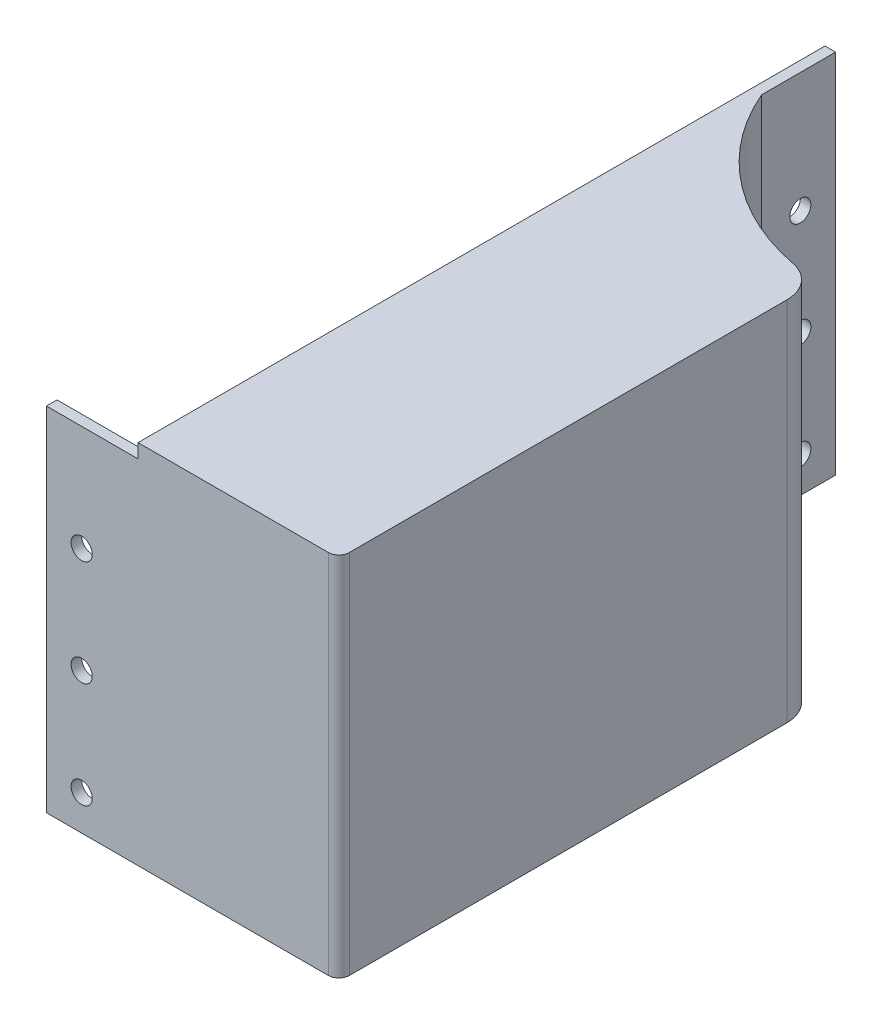
ISO-10303-21;
HEADER;
FILE_DESCRIPTION(('STEP AP214'),'2;1');
FILE_NAME('part.step','',(''),(''),'','','');
FILE_SCHEMA(('AUTOMOTIVE_DESIGN { 1 0 10303 214 1 1 1 1 }'));
ENDSEC;
DATA;
#1=APPLICATION_CONTEXT('core data for automotive mechanical design processes');
#2=APPLICATION_PROTOCOL_DEFINITION('international standard','automotive_design',2000,#1);
#3=PRODUCT_CONTEXT('',#1,'mechanical');
#4=PRODUCT('Part','Part','',(#3));
#5=PRODUCT_RELATED_PRODUCT_CATEGORY('part','',(#4));
#6=PRODUCT_DEFINITION_FORMATION('','',#4);
#7=PRODUCT_DEFINITION_CONTEXT('part definition',#1,'design');
#8=PRODUCT_DEFINITION('design','',#6,#7);
#9=PRODUCT_DEFINITION_SHAPE('','',#8);
#10=(LENGTH_UNIT() NAMED_UNIT(*) SI_UNIT(.MILLI.,.METRE.));
#11=(NAMED_UNIT(*) PLANE_ANGLE_UNIT() SI_UNIT($,.RADIAN.));
#12=(NAMED_UNIT(*) SI_UNIT($,.STERADIAN.) SOLID_ANGLE_UNIT());
#13=UNCERTAINTY_MEASURE_WITH_UNIT(LENGTH_MEASURE(1.E-05),#10,'distance_accuracy_value','');
#14=(GEOMETRIC_REPRESENTATION_CONTEXT(3) GLOBAL_UNCERTAINTY_ASSIGNED_CONTEXT((#13)) GLOBAL_UNIT_ASSIGNED_CONTEXT((#10,
#11,#12)) REPRESENTATION_CONTEXT('',''));
#15=CARTESIAN_POINT('',(0.,0.,0.));
#16=DIRECTION('',(0.,0.,1.));
#17=DIRECTION('',(1.,0.,0.));
#18=AXIS2_PLACEMENT_3D('',#15,#16,#17);
#19=CARTESIAN_POINT('',(58.5616033549649,100.,-174.880780034734));
#20=DIRECTION('',(0.,-1.,0.));
#21=DIRECTION('',(0.,0.,-1.));
#22=AXIS2_PLACEMENT_3D('',#19,#20,#21);
#23=PLANE('',#22);
#24=DIRECTION('',(0.,0.,1.));
#25=VECTOR('',#24,1.);
#26=CARTESIAN_POINT('',(0.,100.,-176.272615505532));
#27=LINE('',#26,#25);
#28=CARTESIAN_POINT('',(0.,100.,15.7273844944684));
#29=VERTEX_POINT('',#28);
#30=CARTESIAN_POINT('',(0.,100.,18.7273844944685));
#31=VERTEX_POINT('',#30);
#32=EDGE_CURVE('E11',#29,#31,#27,.T.);
#33=ORIENTED_EDGE('',*,*,#32,.F.);
#34=DIRECTION('',(-1.,0.,0.));
#35=VECTOR('',#34,1.);
#36=CARTESIAN_POINT('',(-26.,100.,15.7273844944684));
#37=LINE('',#36,#35);
#38=CARTESIAN_POINT('',(-26.,100.,15.7273844944684));
#39=VERTEX_POINT('',#38);
#40=EDGE_CURVE('E250',#29,#39,#37,.T.);
#41=ORIENTED_EDGE('',*,*,#40,.T.);
#42=DIRECTION('',(0.,0.,1.));
#43=VECTOR('',#42,1.);
#44=CARTESIAN_POINT('',(-26.,100.,18.7273844944685));
#45=LINE('',#44,#43);
#46=CARTESIAN_POINT('',(-26.,100.,18.7273844944685));
#47=VERTEX_POINT('',#46);
#48=EDGE_CURVE('E255',#39,#47,#45,.T.);
#49=ORIENTED_EDGE('',*,*,#48,.T.);
#50=DIRECTION('',(1.,0.,0.));
#51=VECTOR('',#50,1.);
#52=CARTESIAN_POINT('',(57.,100.,18.7273844944684));
#53=LINE('',#52,#51);
#54=EDGE_CURVE('E258',#47,#31,#53,.T.);
#55=ORIENTED_EDGE('',*,*,#54,.T.);
#56=EDGE_LOOP('',(#33,#41,#49,#55));
#57=FACE_BOUND('',#56,.T.);
#58=ADVANCED_FACE('F39',(#57),#23,.F.);
#59=CARTESIAN_POINT('',(58.5616033549649,100.,-174.880780034734));
#60=DIRECTION('',(0.,-1.,0.));
#61=DIRECTION('',(0.,0.,-1.));
#62=AXIS2_PLACEMENT_3D('',#59,#60,#61);
#63=CYLINDRICAL_SURFACE('',#62,62.7741227806787);
#64=CARTESIAN_POINT('',(58.5616033549649,0.,-174.880780034734));
#65=DIRECTION('',(0.,1.,0.));
#66=DIRECTION('',(0.,0.,-1.));
#67=AXIS2_PLACEMENT_3D('',#64,#65,#66);
#68=CIRCLE('',#67,62.7741227806787);
#69=CARTESIAN_POINT('',(0.,0.,-152.272615505532));
#70=VERTEX_POINT('',#69);
#71=CARTESIAN_POINT('',(49.7054022215755,0.,-112.734515526168));
#72=VERTEX_POINT('',#71);
#73=EDGE_CURVE('E240',#70,#72,#68,.T.);
#74=ORIENTED_EDGE('',*,*,#73,.T.);
#75=DIRECTION('',(0.,-1.,0.));
#76=VECTOR('',#75,1.);
#77=CARTESIAN_POINT('',(49.7054022215755,100.,-112.734515526168));
#78=LINE('',#77,#76);
#79=CARTESIAN_POINT('',(49.7054022215755,100.,-112.734515526168));
#80=VERTEX_POINT('',#79);
#81=EDGE_CURVE('E63',#72,#80,#78,.F.);
#82=ORIENTED_EDGE('',*,*,#81,.T.);
#83=CARTESIAN_POINT('',(58.5616033549649,100.,-174.880780034734));
#84=DIRECTION('',(0.,1.,0.));
#85=DIRECTION('',(0.,0.,-1.));
#86=AXIS2_PLACEMENT_3D('',#83,#84,#85);
#87=CIRCLE('',#86,62.7741227806787);
#88=CARTESIAN_POINT('',(0.,100.,-152.272615505532));
#89=VERTEX_POINT('',#88);
#90=EDGE_CURVE('E241',#89,#80,#87,.T.);
#91=ORIENTED_EDGE('',*,*,#90,.F.);
#92=DIRECTION('',(0.,-1.,0.));
#93=VECTOR('',#92,1.);
#94=CARTESIAN_POINT('',(0.,100.,-152.272615505532));
#95=LINE('',#94,#93);
#96=EDGE_CURVE('E261',#89,#70,#95,.T.);
#97=ORIENTED_EDGE('',*,*,#96,.T.);
#98=EDGE_LOOP('',(#74,#82,#91,#97));
#99=FACE_BOUND('',#98,.T.);
#100=ADVANCED_FACE('F378',(#99),#63,.T.);
#101=CARTESIAN_POINT('',(54.,100.,15.7273844944684));
#102=DIRECTION('',(1.,0.,0.));
#103=DIRECTION('',(0.,0.,-1.));
#104=AXIS2_PLACEMENT_3D('',#101,#102,#103);
#105=PLANE('',#104);
#106=DIRECTION('',(0.,0.,1.));
#107=VECTOR('',#106,1.);
#108=CARTESIAN_POINT('',(54.,100.,15.7273844944684));
#109=LINE('',#108,#107);
#110=CARTESIAN_POINT('',(54.,100.,-107.784524848824));
#111=VERTEX_POINT('',#110);
#112=CARTESIAN_POINT('',(54.,100.,15.7273844944684));
#113=VERTEX_POINT('',#112);
#114=EDGE_CURVE('E245',#111,#113,#109,.T.);
#115=ORIENTED_EDGE('',*,*,#114,.F.);
#116=DIRECTION('',(0.,1.,0.));
#117=VECTOR('',#116,1.);
#118=CARTESIAN_POINT('',(54.,0.,-107.784524848824));
#119=LINE('',#118,#117);
#120=CARTESIAN_POINT('',(54.,0.,-107.784524848824));
#121=VERTEX_POINT('',#120);
#122=EDGE_CURVE('E330',#111,#121,#119,.F.);
#123=ORIENTED_EDGE('',*,*,#122,.T.);
#124=DIRECTION('',(0.,0.,1.));
#125=VECTOR('',#124,1.);
#126=CARTESIAN_POINT('',(54.,0.,15.7273844944684));
#127=LINE('',#126,#125);
#128=CARTESIAN_POINT('',(54.,0.,15.7273844944684));
#129=VERTEX_POINT('',#128);
#130=EDGE_CURVE('E264',#121,#129,#127,.T.);
#131=ORIENTED_EDGE('',*,*,#130,.T.);
#132=DIRECTION('',(0.,-1.,0.));
#133=VECTOR('',#132,1.);
#134=CARTESIAN_POINT('',(54.,100.,15.7273844944684));
#135=LINE('',#134,#133);
#136=EDGE_CURVE('E305',#113,#129,#135,.T.);
#137=ORIENTED_EDGE('',*,*,#136,.F.);
#138=EDGE_LOOP('',(#115,#123,#131,#137));
#139=FACE_BOUND('',#138,.T.);
#140=ADVANCED_FACE('F358',(#139),#105,.F.);
#141=CARTESIAN_POINT('',(-26.,100.,15.7273844944684));
#142=DIRECTION('',(0.,0.,1.));
#143=DIRECTION('',(1.,0.,0.));
#144=AXIS2_PLACEMENT_3D('',#141,#142,#143);
#145=PLANE('',#144);
#146=CARTESIAN_POINT('',(-16.0000000000006,70.,15.7273844944684));
#147=DIRECTION('',(0.,0.,1.));
#148=DIRECTION('',(1.,0.,0.));
#149=AXIS2_PLACEMENT_3D('',#146,#147,#148);
#150=CIRCLE('',#149,3.);
#151=CARTESIAN_POINT('',(-13.0000000000006,70.,15.7273844944684));
#152=VERTEX_POINT('',#151);
#153=EDGE_CURVE('E236',#152,#152,#150,.T.);
#154=ORIENTED_EDGE('',*,*,#153,.T.);
#155=EDGE_LOOP('',(#154));
#156=FACE_BOUND('',#155,.T.);
#157=CARTESIAN_POINT('',(-16.0000000000003,40.,15.7273844944684));
#158=DIRECTION('',(0.,0.,1.));
#159=DIRECTION('',(1.,0.,0.));
#160=AXIS2_PLACEMENT_3D('',#157,#158,#159);
#161=CIRCLE('',#160,3.);
#162=CARTESIAN_POINT('',(-13.0000000000003,40.,15.7273844944684));
#163=VERTEX_POINT('',#162);
#164=EDGE_CURVE('E232',#163,#163,#161,.T.);
#165=ORIENTED_EDGE('',*,*,#164,.T.);
#166=EDGE_LOOP('',(#165));
#167=FACE_BOUND('',#166,.T.);
#168=CARTESIAN_POINT('',(-16.,10.,15.7273844944684));
#169=DIRECTION('',(0.,0.,1.));
#170=DIRECTION('',(1.,0.,0.));
#171=AXIS2_PLACEMENT_3D('',#168,#169,#170);
#172=CIRCLE('',#171,3.);
#173=CARTESIAN_POINT('',(-13.,10.,15.7273844944684));
#174=VERTEX_POINT('',#173);
#175=EDGE_CURVE('E219',#174,#174,#172,.T.);
#176=ORIENTED_EDGE('',*,*,#175,.T.);
#177=EDGE_LOOP('',(#176));
#178=FACE_BOUND('',#177,.T.);
#179=DIRECTION('',(-1.,0.,0.));
#180=VECTOR('',#179,1.);
#181=CARTESIAN_POINT('',(-26.,0.,15.7273844944684));
#182=LINE('',#181,#180);
#183=CARTESIAN_POINT('',(-26.,0.,15.7273844944684));
#184=VERTEX_POINT('',#183);
#185=EDGE_CURVE('E267',#129,#184,#182,.T.);
#186=ORIENTED_EDGE('',*,*,#185,.T.);
#187=DIRECTION('',(0.,-1.,0.));
#188=VECTOR('',#187,1.);
#189=CARTESIAN_POINT('',(-26.,100.,15.7273844944684));
#190=LINE('',#189,#188);
#191=EDGE_CURVE('E301',#39,#184,#190,.T.);
#192=ORIENTED_EDGE('',*,*,#191,.F.);
#193=ORIENTED_EDGE('',*,*,#40,.F.);
#194=EDGE_CURVE('E251',#113,#29,#37,.T.);
#195=ORIENTED_EDGE('',*,*,#194,.F.);
#196=ORIENTED_EDGE('',*,*,#136,.T.);
#197=EDGE_LOOP('',(#186,#192,#193,#195,#196));
#198=FACE_BOUND('',#197,.T.);
#199=ADVANCED_FACE('F366',(#156,#167,#178,#198),#145,.F.);
#200=CARTESIAN_POINT('',(-26.,100.,18.7273844944685));
#201=DIRECTION('',(1.,0.,0.));
#202=DIRECTION('',(0.,0.,-1.));
#203=AXIS2_PLACEMENT_3D('',#200,#201,#202);
#204=PLANE('',#203);
#205=DIRECTION('',(0.,0.,1.));
#206=VECTOR('',#205,1.);
#207=CARTESIAN_POINT('',(-26.,0.,18.7273844944685));
#208=LINE('',#207,#206);
#209=CARTESIAN_POINT('',(-26.,0.,18.7273844944685));
#210=VERTEX_POINT('',#209);
#211=EDGE_CURVE('E270',#184,#210,#208,.T.);
#212=ORIENTED_EDGE('',*,*,#211,.T.);
#213=DIRECTION('',(0.,-1.,0.));
#214=VECTOR('',#213,1.);
#215=CARTESIAN_POINT('',(-26.,100.,18.7273844944685));
#216=LINE('',#215,#214);
#217=EDGE_CURVE('E297',#47,#210,#216,.T.);
#218=ORIENTED_EDGE('',*,*,#217,.F.);
#219=ORIENTED_EDGE('',*,*,#48,.F.);
#220=ORIENTED_EDGE('',*,*,#191,.T.);
#221=EDGE_LOOP('',(#212,#218,#219,#220));
#222=FACE_BOUND('',#221,.T.);
#223=ADVANCED_FACE('F370',(#222),#204,.F.);
#224=CARTESIAN_POINT('',(57.,100.,18.7273844944684));
#225=DIRECTION('',(0.,0.,-1.));
#226=DIRECTION('',(-1.,0.,0.));
#227=AXIS2_PLACEMENT_3D('',#224,#225,#226);
#228=PLANE('',#227);
#229=CARTESIAN_POINT('',(-16.0000000000006,70.,18.7273844944685));
#230=DIRECTION('',(0.,0.,1.));
#231=DIRECTION('',(1.,0.,0.));
#232=AXIS2_PLACEMENT_3D('',#229,#230,#231);
#233=CIRCLE('',#232,3.);
#234=CARTESIAN_POINT('',(-13.0000000000006,70.,18.7273844944685));
#235=VERTEX_POINT('',#234);
#236=EDGE_CURVE('E215',#235,#235,#233,.T.);
#237=ORIENTED_EDGE('',*,*,#236,.F.);
#238=EDGE_LOOP('',(#237));
#239=FACE_BOUND('',#238,.T.);
#240=CARTESIAN_POINT('',(-16.0000000000003,40.,18.7273844944685));
#241=DIRECTION('',(0.,0.,1.));
#242=DIRECTION('',(1.,0.,0.));
#243=AXIS2_PLACEMENT_3D('',#240,#241,#242);
#244=CIRCLE('',#243,3.);
#245=CARTESIAN_POINT('',(-13.0000000000003,40.,18.7273844944685));
#246=VERTEX_POINT('',#245);
#247=EDGE_CURVE('E220',#246,#246,#244,.T.);
#248=ORIENTED_EDGE('',*,*,#247,.F.);
#249=EDGE_LOOP('',(#248));
#250=FACE_BOUND('',#249,.T.);
#251=CARTESIAN_POINT('',(-16.,10.,18.7273844944685));
#252=DIRECTION('',(0.,0.,1.));
#253=DIRECTION('',(1.,0.,0.));
#254=AXIS2_PLACEMENT_3D('',#251,#252,#253);
#255=CIRCLE('',#254,3.);
#256=CARTESIAN_POINT('',(-13.,10.,18.7273844944685));
#257=VERTEX_POINT('',#256);
#258=EDGE_CURVE('E224',#257,#257,#255,.T.);
#259=ORIENTED_EDGE('',*,*,#258,.F.);
#260=EDGE_LOOP('',(#259));
#261=FACE_BOUND('',#260,.T.);
#262=DIRECTION('',(1.,0.,0.));
#263=VECTOR('',#262,1.);
#264=CARTESIAN_POINT('',(57.,0.,18.7273844944684));
#265=LINE('',#264,#263);
#266=CARTESIAN_POINT('',(54.,0.,18.7273844944684));
#267=VERTEX_POINT('',#266);
#268=EDGE_CURVE('E273',#210,#267,#265,.T.);
#269=ORIENTED_EDGE('',*,*,#268,.T.);
#270=DIRECTION('',(0.,-1.,0.));
#271=VECTOR('',#270,1.);
#272=CARTESIAN_POINT('',(54.,100.,18.7273844944684));
#273=LINE('',#272,#271);
#274=CARTESIAN_POINT('',(54.,104.,18.7273844944684));
#275=VERTEX_POINT('',#274);
#276=EDGE_CURVE('E327',#267,#275,#273,.F.);
#277=ORIENTED_EDGE('',*,*,#276,.T.);
#278=DIRECTION('',(1.,0.,0.));
#279=VECTOR('',#278,1.);
#280=CARTESIAN_POINT('',(0.,104.,18.7273844944685));
#281=LINE('',#280,#279);
#282=CARTESIAN_POINT('',(0.,104.,18.7273844944685));
#283=VERTEX_POINT('',#282);
#284=EDGE_CURVE('E181',#283,#275,#281,.T.);
#285=ORIENTED_EDGE('',*,*,#284,.F.);
#286=DIRECTION('',(0.,-1.,0.));
#287=VECTOR('',#286,1.);
#288=CARTESIAN_POINT('',(0.,104.,18.7273844944685));
#289=LINE('',#288,#287);
#290=EDGE_CURVE('E197',#283,#31,#289,.T.);
#291=ORIENTED_EDGE('',*,*,#290,.T.);
#292=ORIENTED_EDGE('',*,*,#54,.F.);
#293=ORIENTED_EDGE('',*,*,#217,.T.);
#294=EDGE_LOOP('',(#269,#277,#285,#291,#292,#293));
#295=FACE_BOUND('',#294,.T.);
#296=ADVANCED_FACE('F414',(#239,#250,#261,#295),#228,.F.);
#297=CARTESIAN_POINT('',(57.,100.,-117.272615505532));
#298=DIRECTION('',(-1.,0.,0.));
#299=DIRECTION('',(0.,0.,1.));
#300=AXIS2_PLACEMENT_3D('',#297,#298,#299);
#301=PLANE('',#300);
#302=DIRECTION('',(0.,-1.,0.));
#303=VECTOR('',#302,1.);
#304=CARTESIAN_POINT('',(57.,100.,-108.468113503645));
#305=LINE('',#304,#303);
#306=CARTESIAN_POINT('',(57.,0.,-108.468113503645));
#307=VERTEX_POINT('',#306);
#308=CARTESIAN_POINT('',(57.,104.,-108.468113503645));
#309=VERTEX_POINT('',#308);
#310=EDGE_CURVE('E317',#307,#309,#305,.F.);
#311=ORIENTED_EDGE('',*,*,#310,.T.);
#312=DIRECTION('',(0.,0.,-1.));
#313=VECTOR('',#312,1.);
#314=CARTESIAN_POINT('',(57.,104.,15.7273844944684));
#315=LINE('',#314,#313);
#316=CARTESIAN_POINT('',(57.,104.,15.7273844944684));
#317=VERTEX_POINT('',#316);
#318=EDGE_CURVE('E189',#317,#309,#315,.T.);
#319=ORIENTED_EDGE('',*,*,#318,.F.);
#320=DIRECTION('',(0.,-1.,0.));
#321=VECTOR('',#320,1.);
#322=CARTESIAN_POINT('',(57.,100.,15.7273844944684));
#323=LINE('',#322,#321);
#324=CARTESIAN_POINT('',(57.,0.,15.7273844944684));
#325=VERTEX_POINT('',#324);
#326=EDGE_CURVE('E320',#317,#325,#323,.T.);
#327=ORIENTED_EDGE('',*,*,#326,.T.);
#328=DIRECTION('',(0.,0.,-1.));
#329=VECTOR('',#328,1.);
#330=CARTESIAN_POINT('',(57.,0.,-117.272615505532));
#331=LINE('',#330,#329);
#332=EDGE_CURVE('E277',#325,#307,#331,.T.);
#333=ORIENTED_EDGE('',*,*,#332,.T.);
#334=EDGE_LOOP('',(#311,#319,#327,#333));
#335=FACE_BOUND('',#334,.T.);
#336=ADVANCED_FACE('F408',(#335),#301,.F.);
#337=CARTESIAN_POINT('',(60.7261232311468,100.,-179.936053781372));
#338=DIRECTION('',(0.,-1.,0.));
#339=DIRECTION('',(0.,0.,-1.));
#340=AXIS2_PLACEMENT_3D('',#337,#338,#339);
#341=CYLINDRICAL_SURFACE('',#340,62.7741227806788);
#342=DIRECTION('',(0.,-1.,0.));
#343=VECTOR('',#342,1.);
#344=CARTESIAN_POINT('',(3.,100.,-155.272615505532));
#345=LINE('',#344,#343);
#346=CARTESIAN_POINT('',(2.99999999999998,104.,-155.272615505532));
#347=VERTEX_POINT('',#346);
#348=CARTESIAN_POINT('',(3.,0.,-155.272615505532));
#349=VERTEX_POINT('',#348);
#350=EDGE_CURVE('E157',#347,#349,#345,.T.);
#351=ORIENTED_EDGE('',*,*,#350,.F.);
#352=CARTESIAN_POINT('',(60.7261232311468,104.,-179.936053781372));
#353=DIRECTION('',(0.,-1.,0.));
#354=DIRECTION('',(0.,0.,1.));
#355=AXIS2_PLACEMENT_3D('',#352,#353,#354);
#356=CIRCLE('',#355,62.7741227806788);
#357=CARTESIAN_POINT('',(48.8861269235101,104.,-118.288629031275));
#358=VERTEX_POINT('',#357);
#359=EDGE_CURVE('E173',#358,#347,#356,.T.);
#360=ORIENTED_EDGE('',*,*,#359,.F.);
#361=DIRECTION('',(0.,-1.,0.));
#362=VECTOR('',#361,1.);
#363=CARTESIAN_POINT('',(48.8861269235101,100.,-118.288629031275));
#364=LINE('',#363,#362);
#365=CARTESIAN_POINT('',(48.8861269235101,0.,-118.288629031275));
#366=VERTEX_POINT('',#365);
#367=EDGE_CURVE('E309',#358,#366,#364,.T.);
#368=ORIENTED_EDGE('',*,*,#367,.T.);
#369=CARTESIAN_POINT('',(60.7261232311468,0.,-179.936053781372));
#370=DIRECTION('',(0.,-1.,0.));
#371=DIRECTION('',(0.,0.,-1.));
#372=AXIS2_PLACEMENT_3D('',#369,#370,#371);
#373=CIRCLE('',#372,62.7741227806788);
#374=EDGE_CURVE('E280',#366,#349,#373,.T.);
#375=ORIENTED_EDGE('',*,*,#374,.T.);
#376=EDGE_LOOP('',(#351,#360,#368,#375));
#377=FACE_BOUND('',#376,.T.);
#378=ADVANCED_FACE('F411',(#377),#341,.F.);
#379=CARTESIAN_POINT('',(3.,100.,-176.272615505532));
#380=DIRECTION('',(-1.,0.,0.));
#381=DIRECTION('',(0.,0.,1.));
#382=AXIS2_PLACEMENT_3D('',#379,#380,#381);
#383=PLANE('',#382);
#384=CARTESIAN_POINT('',(3.,10.,-166.272615505532));
#385=DIRECTION('',(1.,0.,0.));
#386=DIRECTION('',(0.,0.,-1.));
#387=AXIS2_PLACEMENT_3D('',#384,#385,#386);
#388=CIRCLE('',#387,2.99999999999999);
#389=CARTESIAN_POINT('',(3.,10.,-169.272615505532));
#390=VERTEX_POINT('',#389);
#391=EDGE_CURVE('E203',#390,#390,#388,.T.);
#392=ORIENTED_EDGE('',*,*,#391,.F.);
#393=EDGE_LOOP('',(#392));
#394=FACE_BOUND('',#393,.T.);
#395=CARTESIAN_POINT('',(3.,40.,-166.272615505531));
#396=DIRECTION('',(1.,0.,0.));
#397=DIRECTION('',(0.,0.,-1.));
#398=AXIS2_PLACEMENT_3D('',#395,#396,#397);
#399=CIRCLE('',#398,2.99999999999999);
#400=CARTESIAN_POINT('',(3.,40.,-169.272615505531));
#401=VERTEX_POINT('',#400);
#402=EDGE_CURVE('E208',#401,#401,#399,.T.);
#403=ORIENTED_EDGE('',*,*,#402,.F.);
#404=EDGE_LOOP('',(#403));
#405=FACE_BOUND('',#404,.T.);
#406=CARTESIAN_POINT('',(3.,70.,-166.272615505531));
#407=DIRECTION('',(1.,0.,0.));
#408=DIRECTION('',(0.,0.,-1.));
#409=AXIS2_PLACEMENT_3D('',#406,#407,#408);
#410=CIRCLE('',#409,2.99999999999999);
#411=CARTESIAN_POINT('',(3.,70.,-169.272615505531));
#412=VERTEX_POINT('',#411);
#413=EDGE_CURVE('E202',#412,#412,#410,.T.);
#414=ORIENTED_EDGE('',*,*,#413,.F.);
#415=EDGE_LOOP('',(#414));
#416=FACE_BOUND('',#415,.T.);
#417=DIRECTION('',(0.,0.,-1.));
#418=VECTOR('',#417,1.);
#419=CARTESIAN_POINT('',(3.,0.,-176.272615505532));
#420=LINE('',#419,#418);
#421=CARTESIAN_POINT('',(3.,0.,-176.272615505532));
#422=VERTEX_POINT('',#421);
#423=EDGE_CURVE('E153',#349,#422,#420,.T.);
#424=ORIENTED_EDGE('',*,*,#423,.T.);
#425=DIRECTION('',(0.,-1.,0.));
#426=VECTOR('',#425,1.);
#427=CARTESIAN_POINT('',(3.,100.,-176.272615505532));
#428=LINE('',#427,#426);
#429=CARTESIAN_POINT('',(3.,104.,-176.272615505532));
#430=VERTEX_POINT('',#429);
#431=EDGE_CURVE('E146',#430,#422,#428,.T.);
#432=ORIENTED_EDGE('',*,*,#431,.F.);
#433=DIRECTION('',(0.,0.,-1.));
#434=VECTOR('',#433,1.);
#435=CARTESIAN_POINT('',(3.,104.,-155.272615505532));
#436=LINE('',#435,#434);
#437=EDGE_CURVE('E151',#347,#430,#436,.T.);
#438=ORIENTED_EDGE('',*,*,#437,.F.);
#439=ORIENTED_EDGE('',*,*,#350,.T.);
#440=EDGE_LOOP('',(#424,#432,#438,#439));
#441=FACE_BOUND('',#440,.T.);
#442=ADVANCED_FACE('F148',(#394,#405,#416,#441),#383,.F.);
#443=CARTESIAN_POINT('',(0.,100.,-176.272615505532));
#444=DIRECTION('',(0.,0.,1.));
#445=DIRECTION('',(1.,0.,0.));
#446=AXIS2_PLACEMENT_3D('',#443,#444,#445);
#447=PLANE('',#446);
#448=DIRECTION('',(-1.,0.,0.));
#449=VECTOR('',#448,1.);
#450=CARTESIAN_POINT('',(0.,0.,-176.272615505532));
#451=LINE('',#450,#449);
#452=CARTESIAN_POINT('',(0.,0.,-176.272615505532));
#453=VERTEX_POINT('',#452);
#454=EDGE_CURVE('E285',#422,#453,#451,.T.);
#455=ORIENTED_EDGE('',*,*,#454,.T.);
#456=DIRECTION('',(0.,-1.,0.));
#457=VECTOR('',#456,1.);
#458=CARTESIAN_POINT('',(0.,100.,-176.272615505532));
#459=LINE('',#458,#457);
#460=CARTESIAN_POINT('',(0.,104.,-176.272615505532));
#461=VERTEX_POINT('',#460);
#462=EDGE_CURVE('E158',#461,#453,#459,.T.);
#463=ORIENTED_EDGE('',*,*,#462,.F.);
#464=DIRECTION('',(-1.,0.,0.));
#465=VECTOR('',#464,1.);
#466=CARTESIAN_POINT('',(3.,104.,-176.272615505532));
#467=LINE('',#466,#465);
#468=EDGE_CURVE('E161',#430,#461,#467,.T.);
#469=ORIENTED_EDGE('',*,*,#468,.F.);
#470=ORIENTED_EDGE('',*,*,#431,.T.);
#471=EDGE_LOOP('',(#455,#463,#469,#470));
#472=FACE_BOUND('',#471,.T.);
#473=ADVANCED_FACE('F162',(#472),#447,.F.);
#474=CARTESIAN_POINT('',(0.,100.,-152.272615505532));
#475=DIRECTION('',(1.,0.,0.));
#476=DIRECTION('',(0.,0.,-1.));
#477=AXIS2_PLACEMENT_3D('',#474,#475,#476);
#478=PLANE('',#477);
#479=CARTESIAN_POINT('',(0.,10.,-166.272615505532));
#480=DIRECTION('',(1.,0.,0.));
#481=DIRECTION('',(0.,0.,-1.));
#482=AXIS2_PLACEMENT_3D('',#479,#480,#481);
#483=CIRCLE('',#482,2.99999999999999);
#484=CARTESIAN_POINT('',(0.,10.,-169.272615505532));
#485=VERTEX_POINT('',#484);
#486=EDGE_CURVE('E228',#485,#485,#483,.T.);
#487=ORIENTED_EDGE('',*,*,#486,.T.);
#488=EDGE_LOOP('',(#487));
#489=FACE_BOUND('',#488,.T.);
#490=CARTESIAN_POINT('',(0.,40.,-166.272615505531));
#491=DIRECTION('',(1.,0.,0.));
#492=DIRECTION('',(0.,0.,-1.));
#493=AXIS2_PLACEMENT_3D('',#490,#491,#492);
#494=CIRCLE('',#493,2.99999999999999);
#495=CARTESIAN_POINT('',(0.,40.,-169.272615505531));
#496=VERTEX_POINT('',#495);
#497=EDGE_CURVE('E334',#496,#496,#494,.T.);
#498=ORIENTED_EDGE('',*,*,#497,.T.);
#499=EDGE_LOOP('',(#498));
#500=FACE_BOUND('',#499,.T.);
#501=CARTESIAN_POINT('',(0.,70.,-166.272615505531));
#502=DIRECTION('',(1.,0.,0.));
#503=DIRECTION('',(0.,0.,-1.));
#504=AXIS2_PLACEMENT_3D('',#501,#502,#503);
#505=CIRCLE('',#504,2.99999999999999);
#506=CARTESIAN_POINT('',(0.,70.,-169.272615505531));
#507=VERTEX_POINT('',#506);
#508=EDGE_CURVE('E207',#507,#507,#505,.T.);
#509=ORIENTED_EDGE('',*,*,#508,.T.);
#510=EDGE_LOOP('',(#509));
#511=FACE_BOUND('',#510,.T.);
#512=DIRECTION('',(0.,0.,1.));
#513=VECTOR('',#512,1.);
#514=CARTESIAN_POINT('',(0.,0.,-152.272615505532));
#515=LINE('',#514,#513);
#516=EDGE_CURVE('E246',#453,#70,#515,.T.);
#517=ORIENTED_EDGE('',*,*,#516,.T.);
#518=ORIENTED_EDGE('',*,*,#96,.F.);
#519=EDGE_CURVE('E50',#89,#29,#27,.T.);
#520=ORIENTED_EDGE('',*,*,#519,.T.);
#521=ORIENTED_EDGE('',*,*,#32,.T.);
#522=ORIENTED_EDGE('',*,*,#290,.F.);
#523=DIRECTION('',(0.,0.,1.));
#524=VECTOR('',#523,1.);
#525=CARTESIAN_POINT('',(0.,104.,-176.272615505532));
#526=LINE('',#525,#524);
#527=EDGE_CURVE('E167',#461,#283,#526,.T.);
#528=ORIENTED_EDGE('',*,*,#527,.F.);
#529=ORIENTED_EDGE('',*,*,#462,.T.);
#530=EDGE_LOOP('',(#517,#518,#520,#521,#522,#528,#529));
#531=FACE_BOUND('',#530,.T.);
#532=ADVANCED_FACE('F375',(#489,#500,#511,#531),#478,.F.);
#533=CARTESIAN_POINT('',(58.5616033549649,0.,-174.880780034734));
#534=DIRECTION('',(0.,-1.,0.));
#535=DIRECTION('',(0.,0.,-1.));
#536=AXIS2_PLACEMENT_3D('',#533,#534,#535);
#537=PLANE('',#536);
#538=ORIENTED_EDGE('',*,*,#332,.F.);
#539=CARTESIAN_POINT('',(54.,0.,15.7273844944684));
#540=DIRECTION('',(0.,-1.,0.));
#541=DIRECTION('',(0.,0.,-1.));
#542=AXIS2_PLACEMENT_3D('',#539,#540,#541);
#543=CIRCLE('',#542,3.);
#544=EDGE_CURVE('E324',#325,#267,#543,.T.);
#545=ORIENTED_EDGE('',*,*,#544,.T.);
#546=ORIENTED_EDGE('',*,*,#268,.F.);
#547=ORIENTED_EDGE('',*,*,#211,.F.);
#548=ORIENTED_EDGE('',*,*,#185,.F.);
#549=ORIENTED_EDGE('',*,*,#130,.F.);
#550=CARTESIAN_POINT('',(49.,0.,-107.784524848824));
#551=DIRECTION('',(0.,-1.,0.));
#552=DIRECTION('',(0.,0.,-1.));
#553=AXIS2_PLACEMENT_3D('',#550,#551,#552);
#554=CIRCLE('',#553,5.);
#555=EDGE_CURVE('E345',#121,#72,#554,.F.);
#556=ORIENTED_EDGE('',*,*,#555,.T.);
#557=ORIENTED_EDGE('',*,*,#73,.F.);
#558=ORIENTED_EDGE('',*,*,#516,.F.);
#559=ORIENTED_EDGE('',*,*,#454,.F.);
#560=ORIENTED_EDGE('',*,*,#423,.F.);
#561=ORIENTED_EDGE('',*,*,#374,.F.);
#562=CARTESIAN_POINT('',(47.,0.,-108.468113503645));
#563=DIRECTION('',(0.,-1.,0.));
#564=DIRECTION('',(0.,0.,-1.));
#565=AXIS2_PLACEMENT_3D('',#562,#563,#564);
#566=CIRCLE('',#565,10.);
#567=EDGE_CURVE('E313',#366,#307,#566,.T.);
#568=ORIENTED_EDGE('',*,*,#567,.T.);
#569=EDGE_LOOP('',(#538,#545,#546,#547,#548,#549,#556,#557,#558,#559,#560,#561,#568));
#570=FACE_BOUND('',#569,.T.);
#571=ADVANCED_FACE('F361',(#570),#537,.T.);
#572=CARTESIAN_POINT('',(47.,100.,-108.468113503645));
#573=DIRECTION('',(0.,-1.,0.));
#574=DIRECTION('',(0.,0.,-1.));
#575=AXIS2_PLACEMENT_3D('',#572,#573,#574);
#576=CYLINDRICAL_SURFACE('',#575,10.);
#577=ORIENTED_EDGE('',*,*,#367,.F.);
#578=CARTESIAN_POINT('',(47.,104.,-108.468113503645));
#579=DIRECTION('',(0.,1.,0.));
#580=DIRECTION('',(0.,0.,1.));
#581=AXIS2_PLACEMENT_3D('',#578,#579,#580);
#582=CIRCLE('',#581,10.);
#583=EDGE_CURVE('E193',#309,#358,#582,.T.);
#584=ORIENTED_EDGE('',*,*,#583,.F.);
#585=ORIENTED_EDGE('',*,*,#310,.F.);
#586=ORIENTED_EDGE('',*,*,#567,.F.);
#587=EDGE_LOOP('',(#577,#584,#585,#586));
#588=FACE_BOUND('',#587,.T.);
#589=ADVANCED_FACE('F389',(#588),#576,.T.);
#590=CARTESIAN_POINT('',(54.,100.,15.7273844944684));
#591=DIRECTION('',(0.,-1.,0.));
#592=DIRECTION('',(0.,0.,-1.));
#593=AXIS2_PLACEMENT_3D('',#590,#591,#592);
#594=CYLINDRICAL_SURFACE('',#593,3.);
#595=ORIENTED_EDGE('',*,*,#326,.F.);
#596=CARTESIAN_POINT('',(54.,104.,15.7273844944684));
#597=DIRECTION('',(0.,1.,0.));
#598=DIRECTION('',(0.,0.,1.));
#599=AXIS2_PLACEMENT_3D('',#596,#597,#598);
#600=CIRCLE('',#599,3.);
#601=EDGE_CURVE('E185',#275,#317,#600,.T.);
#602=ORIENTED_EDGE('',*,*,#601,.F.);
#603=ORIENTED_EDGE('',*,*,#276,.F.);
#604=ORIENTED_EDGE('',*,*,#544,.F.);
#605=EDGE_LOOP('',(#595,#602,#603,#604));
#606=FACE_BOUND('',#605,.T.);
#607=ADVANCED_FACE('F391',(#606),#594,.T.);
#608=CARTESIAN_POINT('',(-16.,10.,-41.2726155055315));
#609=DIRECTION('',(0.,0.,1.));
#610=DIRECTION('',(1.,0.,0.));
#611=AXIS2_PLACEMENT_3D('',#608,#609,#610);
#612=CYLINDRICAL_SURFACE('',#611,3.);
#613=ORIENTED_EDGE('',*,*,#258,.T.);
#614=EDGE_LOOP('',(#613));
#615=FACE_BOUND('',#614,.T.);
#616=ORIENTED_EDGE('',*,*,#175,.F.);
#617=EDGE_LOOP('',(#616));
#618=FACE_BOUND('',#617,.T.);
#619=ADVANCED_FACE('F394',(#615,#618),#612,.F.);
#620=CARTESIAN_POINT('',(-16.0000000000003,40.,-41.2726155055315));
#621=DIRECTION('',(0.,0.,1.));
#622=DIRECTION('',(1.,0.,0.));
#623=AXIS2_PLACEMENT_3D('',#620,#621,#622);
#624=CYLINDRICAL_SURFACE('',#623,3.);
#625=ORIENTED_EDGE('',*,*,#247,.T.);
#626=EDGE_LOOP('',(#625));
#627=FACE_BOUND('',#626,.T.);
#628=ORIENTED_EDGE('',*,*,#164,.F.);
#629=EDGE_LOOP('',(#628));
#630=FACE_BOUND('',#629,.T.);
#631=ADVANCED_FACE('F399',(#627,#630),#624,.F.);
#632=CARTESIAN_POINT('',(-16.0000000000006,70.,-41.2726155055315));
#633=DIRECTION('',(0.,0.,1.));
#634=DIRECTION('',(1.,0.,0.));
#635=AXIS2_PLACEMENT_3D('',#632,#633,#634);
#636=CYLINDRICAL_SURFACE('',#635,3.);
#637=ORIENTED_EDGE('',*,*,#236,.T.);
#638=EDGE_LOOP('',(#637));
#639=FACE_BOUND('',#638,.T.);
#640=ORIENTED_EDGE('',*,*,#153,.F.);
#641=EDGE_LOOP('',(#640));
#642=FACE_BOUND('',#641,.T.);
#643=ADVANCED_FACE('F439',(#639,#642),#636,.F.);
#644=CARTESIAN_POINT('',(-57.,70.,-166.272615505531));
#645=DIRECTION('',(1.,0.,0.));
#646=DIRECTION('',(0.,0.,-1.));
#647=AXIS2_PLACEMENT_3D('',#644,#645,#646);
#648=CYLINDRICAL_SURFACE('',#647,2.99999999999999);
#649=ORIENTED_EDGE('',*,*,#413,.T.);
#650=EDGE_LOOP('',(#649));
#651=FACE_BOUND('',#650,.T.);
#652=ORIENTED_EDGE('',*,*,#508,.F.);
#653=EDGE_LOOP('',(#652));
#654=FACE_BOUND('',#653,.T.);
#655=ADVANCED_FACE('F445',(#651,#654),#648,.F.);
#656=CARTESIAN_POINT('',(-57.,40.,-166.272615505531));
#657=DIRECTION('',(1.,0.,0.));
#658=DIRECTION('',(0.,0.,-1.));
#659=AXIS2_PLACEMENT_3D('',#656,#657,#658);
#660=CYLINDRICAL_SURFACE('',#659,2.99999999999999);
#661=ORIENTED_EDGE('',*,*,#402,.T.);
#662=EDGE_LOOP('',(#661));
#663=FACE_BOUND('',#662,.T.);
#664=ORIENTED_EDGE('',*,*,#497,.F.);
#665=EDGE_LOOP('',(#664));
#666=FACE_BOUND('',#665,.T.);
#667=ADVANCED_FACE('F525',(#663,#666),#660,.F.);
#668=CARTESIAN_POINT('',(-57.,10.,-166.272615505532));
#669=DIRECTION('',(1.,0.,0.));
#670=DIRECTION('',(0.,0.,-1.));
#671=AXIS2_PLACEMENT_3D('',#668,#669,#670);
#672=CYLINDRICAL_SURFACE('',#671,2.99999999999999);
#673=ORIENTED_EDGE('',*,*,#391,.T.);
#674=EDGE_LOOP('',(#673));
#675=FACE_BOUND('',#674,.T.);
#676=ORIENTED_EDGE('',*,*,#486,.F.);
#677=EDGE_LOOP('',(#676));
#678=FACE_BOUND('',#677,.T.);
#679=ADVANCED_FACE('F502',(#675,#678),#672,.F.);
#680=CARTESIAN_POINT('',(49.,100.,-107.784524848824));
#681=DIRECTION('',(0.,-1.,0.));
#682=DIRECTION('',(0.,0.,-1.));
#683=AXIS2_PLACEMENT_3D('',#680,#681,#682);
#684=CYLINDRICAL_SURFACE('',#683,5.);
#685=CARTESIAN_POINT('',(49.,100.,-107.784524848824));
#686=DIRECTION('',(0.,-1.,0.));
#687=DIRECTION('',(0.,0.,-1.));
#688=AXIS2_PLACEMENT_3D('',#685,#686,#687);
#689=CIRCLE('',#688,5.);
#690=EDGE_CURVE('E43',#80,#111,#689,.T.);
#691=ORIENTED_EDGE('',*,*,#690,.F.);
#692=ORIENTED_EDGE('',*,*,#81,.F.);
#693=ORIENTED_EDGE('',*,*,#555,.F.);
#694=ORIENTED_EDGE('',*,*,#122,.F.);
#695=EDGE_LOOP('',(#691,#692,#693,#694));
#696=FACE_BOUND('',#695,.T.);
#697=ADVANCED_FACE('F41',(#696),#684,.F.);
#698=CARTESIAN_POINT('',(54.,100.,15.7273844944684));
#699=DIRECTION('',(0.,1.,0.));
#700=DIRECTION('',(0.,0.,1.));
#701=AXIS2_PLACEMENT_3D('',#698,#699,#700);
#702=PLANE('',#701);
#703=ORIENTED_EDGE('',*,*,#519,.F.);
#704=ORIENTED_EDGE('',*,*,#90,.T.);
#705=ORIENTED_EDGE('',*,*,#690,.T.);
#706=ORIENTED_EDGE('',*,*,#114,.T.);
#707=ORIENTED_EDGE('',*,*,#194,.T.);
#708=EDGE_LOOP('',(#703,#704,#705,#706,#707));
#709=FACE_BOUND('',#708,.T.);
#710=ADVANCED_FACE('F354',(#709),#702,.F.);
#711=CARTESIAN_POINT('',(54.,104.,15.7273844944684));
#712=DIRECTION('',(0.,1.,0.));
#713=DIRECTION('',(0.,0.,1.));
#714=AXIS2_PLACEMENT_3D('',#711,#712,#713);
#715=PLANE('',#714);
#716=ORIENTED_EDGE('',*,*,#437,.T.);
#717=ORIENTED_EDGE('',*,*,#468,.T.);
#718=ORIENTED_EDGE('',*,*,#527,.T.);
#719=ORIENTED_EDGE('',*,*,#284,.T.);
#720=ORIENTED_EDGE('',*,*,#601,.T.);
#721=ORIENTED_EDGE('',*,*,#318,.T.);
#722=ORIENTED_EDGE('',*,*,#583,.T.);
#723=ORIENTED_EDGE('',*,*,#359,.T.);
#724=EDGE_LOOP('',(#716,#717,#718,#719,#720,#721,#722,#723));
#725=FACE_BOUND('',#724,.T.);
#726=ADVANCED_FACE('F170',(#725),#715,.T.);
#727=CLOSED_SHELL('',(#58,#100,#140,#199,#223,#296,#336,#378,#442,#473,#532,#571,#589,#607,#619,
#631,#643,#655,#667,#679,#697,#710,#726));
#728=MANIFOLD_SOLID_BREP('B2',#727);
#729=ADVANCED_BREP_SHAPE_REPRESENTATION('',(#18,#728),#14);
#730=SHAPE_DEFINITION_REPRESENTATION(#9,#729);
ENDSEC;
END-ISO-10303-21;
